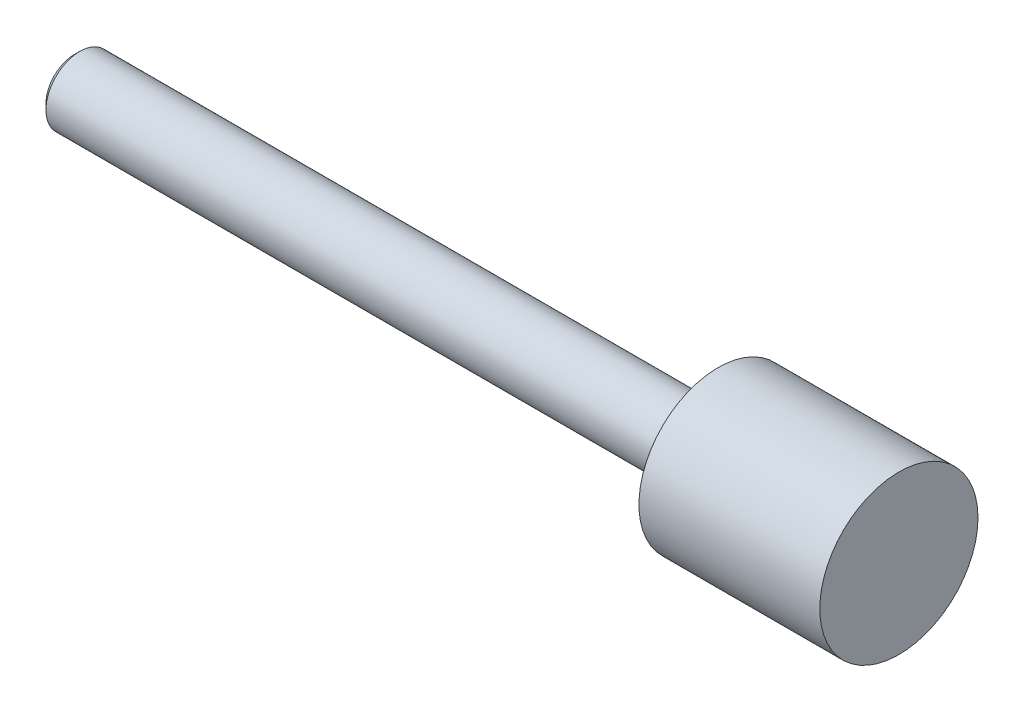
ISO-10303-21;
HEADER;
FILE_DESCRIPTION(('STEP AP214'),'2;1');
FILE_NAME('part.step','',(''),(''),'','','');
FILE_SCHEMA(('AUTOMOTIVE_DESIGN { 1 0 10303 214 1 1 1 1 }'));
ENDSEC;
DATA;
#1=APPLICATION_CONTEXT('core data for automotive mechanical design processes');
#2=APPLICATION_PROTOCOL_DEFINITION('international standard','automotive_design',2000,#1);
#3=PRODUCT_CONTEXT('',#1,'mechanical');
#4=PRODUCT('Part','Part','',(#3));
#5=PRODUCT_RELATED_PRODUCT_CATEGORY('part','',(#4));
#6=PRODUCT_DEFINITION_FORMATION('','',#4);
#7=PRODUCT_DEFINITION_CONTEXT('part definition',#1,'design');
#8=PRODUCT_DEFINITION('design','',#6,#7);
#9=PRODUCT_DEFINITION_SHAPE('','',#8);
#10=(LENGTH_UNIT() NAMED_UNIT(*) SI_UNIT(.MILLI.,.METRE.));
#11=(NAMED_UNIT(*) PLANE_ANGLE_UNIT() SI_UNIT($,.RADIAN.));
#12=(NAMED_UNIT(*) SI_UNIT($,.STERADIAN.) SOLID_ANGLE_UNIT());
#13=UNCERTAINTY_MEASURE_WITH_UNIT(LENGTH_MEASURE(1.E-05),#10,'distance_accuracy_value','');
#14=(GEOMETRIC_REPRESENTATION_CONTEXT(3) GLOBAL_UNCERTAINTY_ASSIGNED_CONTEXT((#13)) GLOBAL_UNIT_ASSIGNED_CONTEXT((#10,
#11,#12)) REPRESENTATION_CONTEXT('',''));
#15=CARTESIAN_POINT('',(0.,0.,0.));
#16=DIRECTION('',(0.,0.,1.));
#17=DIRECTION('',(1.,0.,0.));
#18=AXIS2_PLACEMENT_3D('',#15,#16,#17);
#19=CARTESIAN_POINT('',(432.47337137926,0.,0.));
#20=DIRECTION('',(-1.,0.,0.));
#21=DIRECTION('',(0.,0.,1.));
#22=AXIS2_PLACEMENT_3D('',#19,#20,#21);
#23=PLANE('',#22);
#24=CARTESIAN_POINT('',(432.47337137926,0.,0.));
#25=DIRECTION('',(1.,0.,0.));
#26=DIRECTION('',(0.,0.,-1.));
#27=AXIS2_PLACEMENT_3D('',#24,#25,#26);
#28=CIRCLE('',#27,5.55625000000001);
#29=CARTESIAN_POINT('',(432.47337137926,0.,-5.55625000000001));
#30=VERTEX_POINT('',#29);
#31=EDGE_CURVE('E19',#30,#30,#28,.F.);
#32=ORIENTED_EDGE('',*,*,#31,.F.);
#33=EDGE_LOOP('',(#32));
#34=FACE_BOUND('',#33,.T.);
#35=ADVANCED_FACE('F16',(#34),#23,.F.);
#36=CARTESIAN_POINT('',(374.56137137926,0.,0.));
#37=DIRECTION('',(-1.,0.,0.));
#38=DIRECTION('',(0.,0.,1.));
#39=AXIS2_PLACEMENT_3D('',#36,#37,#38);
#40=PLANE('',#39);
#41=CARTESIAN_POINT('',(374.561371379286,0.,0.));
#42=DIRECTION('',(1.,0.,0.));
#43=DIRECTION('',(0.,0.,-1.));
#44=AXIS2_PLACEMENT_3D('',#41,#42,#43);
#45=CIRCLE('',#44,1.99390000000221);
#46=CARTESIAN_POINT('',(374.561371379286,0.,-1.99390000000221));
#47=VERTEX_POINT('',#46);
#48=EDGE_CURVE('E32',#47,#47,#45,.T.);
#49=ORIENTED_EDGE('',*,*,#48,.F.);
#50=EDGE_LOOP('',(#49));
#51=FACE_BOUND('',#50,.T.);
#52=ADVANCED_FACE('F43',(#51),#40,.T.);
#53=CARTESIAN_POINT('',(419.77337137926,0.,0.));
#54=DIRECTION('',(1.,0.,0.));
#55=DIRECTION('',(0.,0.,-1.));
#56=AXIS2_PLACEMENT_3D('',#53,#54,#55);
#57=CYLINDRICAL_SURFACE('',#56,5.55625000000001);
#58=ORIENTED_EDGE('',*,*,#31,.T.);
#59=EDGE_LOOP('',(#58));
#60=FACE_BOUND('',#59,.T.);
#61=CARTESIAN_POINT('',(419.77337137926,0.,0.));
#62=DIRECTION('',(1.,0.,0.));
#63=DIRECTION('',(0.,0.,-1.));
#64=AXIS2_PLACEMENT_3D('',#61,#62,#63);
#65=CIRCLE('',#64,5.55625000000001);
#66=CARTESIAN_POINT('',(419.77337137926,0.,-5.55625000000001));
#67=VERTEX_POINT('',#66);
#68=EDGE_CURVE('E28',#67,#67,#65,.F.);
#69=ORIENTED_EDGE('',*,*,#68,.F.);
#70=EDGE_LOOP('',(#69));
#71=FACE_BOUND('',#70,.T.);
#72=ADVANCED_FACE('F39',(#60,#71),#57,.T.);
#73=CARTESIAN_POINT('',(374.942371379291,0.,0.));
#74=DIRECTION('',(1.,0.,0.));
#75=DIRECTION('',(0.,0.,-1.));
#76=AXIS2_PLACEMENT_3D('',#73,#74,#75);
#77=CONICAL_SURFACE('',#76,2.37489999994978,0.785398163322851);
#78=CARTESIAN_POINT('',(374.94237137926,0.,0.));
#79=DIRECTION('',(1.,0.,0.));
#80=DIRECTION('',(0.,0.,-1.));
#81=AXIS2_PLACEMENT_3D('',#78,#79,#80);
#82=CIRCLE('',#81,2.3749);
#83=CARTESIAN_POINT('',(374.94237137926,0.,-2.3749));
#84=VERTEX_POINT('',#83);
#85=EDGE_CURVE('E23',#84,#84,#82,.T.);
#86=ORIENTED_EDGE('',*,*,#85,.F.);
#87=EDGE_LOOP('',(#86));
#88=FACE_BOUND('',#87,.T.);
#89=ORIENTED_EDGE('',*,*,#48,.T.);
#90=EDGE_LOOP('',(#89));
#91=FACE_BOUND('',#90,.T.);
#92=ADVANCED_FACE('F55',(#88,#91),#77,.T.);
#93=CARTESIAN_POINT('',(419.77337137926,0.,0.));
#94=DIRECTION('',(-1.,0.,0.));
#95=DIRECTION('',(0.,0.,1.));
#96=AXIS2_PLACEMENT_3D('',#93,#94,#95);
#97=PLANE('',#96);
#98=CARTESIAN_POINT('',(419.77337137926,0.,0.));
#99=DIRECTION('',(1.,0.,0.));
#100=DIRECTION('',(0.,0.,-1.));
#101=AXIS2_PLACEMENT_3D('',#98,#99,#100);
#102=CIRCLE('',#101,2.3749);
#103=CARTESIAN_POINT('',(419.77337137926,0.,-2.3749));
#104=VERTEX_POINT('',#103);
#105=EDGE_CURVE('E10',#104,#104,#102,.F.);
#106=ORIENTED_EDGE('',*,*,#105,.F.);
#107=EDGE_LOOP('',(#106));
#108=FACE_BOUND('',#107,.T.);
#109=ORIENTED_EDGE('',*,*,#68,.T.);
#110=EDGE_LOOP('',(#109));
#111=FACE_BOUND('',#110,.T.);
#112=ADVANCED_FACE('F50',(#108,#111),#97,.T.);
#113=CARTESIAN_POINT('',(367.844139800701,0.,0.));
#114=DIRECTION('',(1.,0.,0.));
#115=DIRECTION('',(0.,0.,-1.));
#116=AXIS2_PLACEMENT_3D('',#113,#114,#115);
#117=CYLINDRICAL_SURFACE('',#116,2.3749);
#118=ORIENTED_EDGE('',*,*,#105,.T.);
#119=EDGE_LOOP('',(#118));
#120=FACE_BOUND('',#119,.T.);
#121=ORIENTED_EDGE('',*,*,#85,.T.);
#122=EDGE_LOOP('',(#121));
#123=FACE_BOUND('',#122,.T.);
#124=ADVANCED_FACE('F48',(#120,#123),#117,.T.);
#125=CLOSED_SHELL('',(#35,#52,#72,#92,#112,#124));
#126=MANIFOLD_SOLID_BREP('B1',#125);
#127=ADVANCED_BREP_SHAPE_REPRESENTATION('',(#18,#126),#14);
#128=SHAPE_DEFINITION_REPRESENTATION(#9,#127);
ENDSEC;
END-ISO-10303-21;
